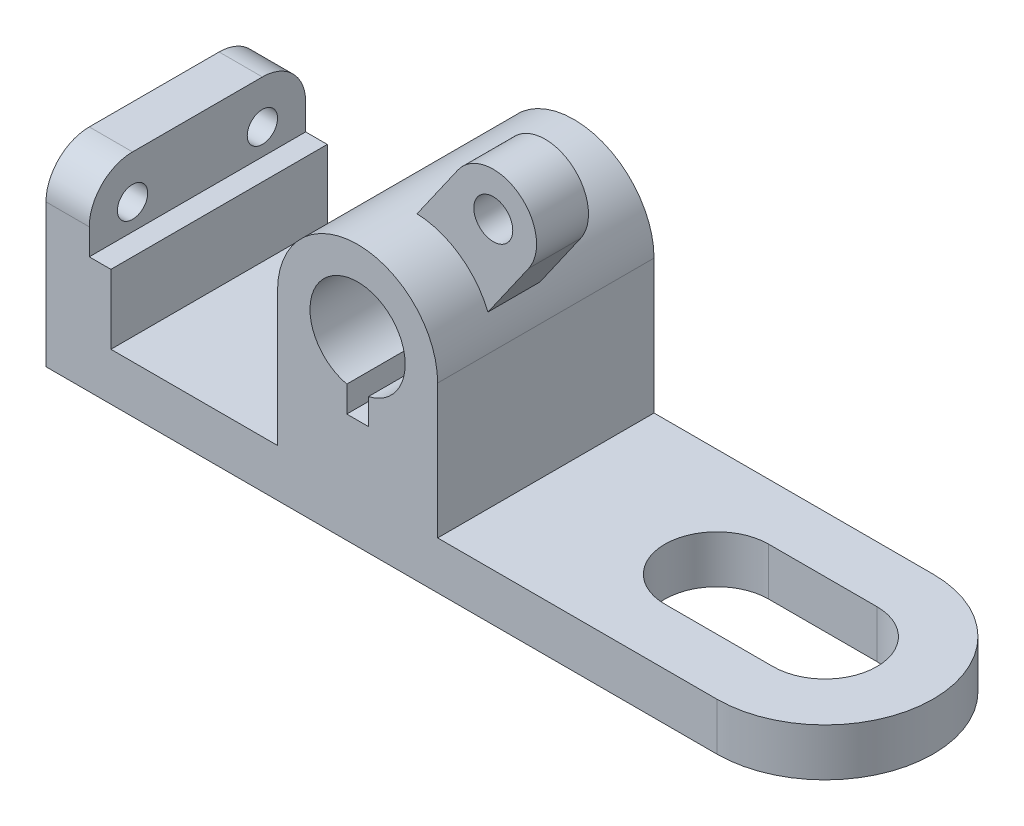
ISO-10303-21;
HEADER;
FILE_DESCRIPTION(('STEP AP214'),'2;1');
FILE_NAME('part.step','',(''),(''),'','','');
FILE_SCHEMA(('AUTOMOTIVE_DESIGN { 1 0 10303 214 1 1 1 1 }'));
ENDSEC;
DATA;
#1=APPLICATION_CONTEXT('core data for automotive mechanical design processes');
#2=APPLICATION_PROTOCOL_DEFINITION('international standard','automotive_design',2000,#1);
#3=PRODUCT_CONTEXT('',#1,'mechanical');
#4=PRODUCT('Part','Part','',(#3));
#5=PRODUCT_RELATED_PRODUCT_CATEGORY('part','',(#4));
#6=PRODUCT_DEFINITION_FORMATION('','',#4);
#7=PRODUCT_DEFINITION_CONTEXT('part definition',#1,'design');
#8=PRODUCT_DEFINITION('design','',#6,#7);
#9=PRODUCT_DEFINITION_SHAPE('','',#8);
#10=(LENGTH_UNIT() NAMED_UNIT(*) SI_UNIT(.MILLI.,.METRE.));
#11=(NAMED_UNIT(*) PLANE_ANGLE_UNIT() SI_UNIT($,.RADIAN.));
#12=(NAMED_UNIT(*) SI_UNIT($,.STERADIAN.) SOLID_ANGLE_UNIT());
#13=UNCERTAINTY_MEASURE_WITH_UNIT(LENGTH_MEASURE(1.E-05),#10,'distance_accuracy_value','');
#14=(GEOMETRIC_REPRESENTATION_CONTEXT(3) GLOBAL_UNCERTAINTY_ASSIGNED_CONTEXT((#13)) GLOBAL_UNIT_ASSIGNED_CONTEXT((#10,
#11,#12)) REPRESENTATION_CONTEXT('',''));
#15=CARTESIAN_POINT('',(0.,0.,0.));
#16=DIRECTION('',(0.,0.,1.));
#17=DIRECTION('',(1.,0.,0.));
#18=AXIS2_PLACEMENT_3D('',#15,#16,#17);
#19=CARTESIAN_POINT('',(0.,0.,25.));
#20=DIRECTION('',(0.,0.,1.));
#21=DIRECTION('',(1.,0.,0.));
#22=AXIS2_PLACEMENT_3D('',#19,#20,#21);
#23=PLANE('',#22);
#24=CARTESIAN_POINT('',(0.,42.,25.));
#25=DIRECTION('',(0.,0.,1.));
#26=DIRECTION('',(1.,0.,0.));
#27=AXIS2_PLACEMENT_3D('',#24,#25,#26);
#28=CIRCLE('',#27,11.);
#29=CARTESIAN_POINT('',(2.5,31.2878573571857,25.));
#30=VERTEX_POINT('',#29);
#31=CARTESIAN_POINT('',(-2.5,31.2878573571857,25.));
#32=VERTEX_POINT('',#31);
#33=EDGE_CURVE('E336',#30,#32,#28,.T.);
#34=ORIENTED_EDGE('',*,*,#33,.F.);
#35=DIRECTION('',(0.,-1.,0.));
#36=VECTOR('',#35,1.);
#37=CARTESIAN_POINT('',(2.5,0.,25.));
#38=LINE('',#37,#36);
#39=CARTESIAN_POINT('',(2.5,25.2878573571857,25.));
#40=VERTEX_POINT('',#39);
#41=EDGE_CURVE('E407',#30,#40,#38,.T.);
#42=ORIENTED_EDGE('',*,*,#41,.T.);
#43=DIRECTION('',(-1.,0.,0.));
#44=VECTOR('',#43,1.);
#45=CARTESIAN_POINT('',(0.,25.2878573571857,25.));
#46=LINE('',#45,#44);
#47=CARTESIAN_POINT('',(-2.5,25.2878573571857,25.));
#48=VERTEX_POINT('',#47);
#49=EDGE_CURVE('E404',#40,#48,#46,.T.);
#50=ORIENTED_EDGE('',*,*,#49,.T.);
#51=DIRECTION('',(0.,-1.,0.));
#52=VECTOR('',#51,1.);
#53=CARTESIAN_POINT('',(-2.5,0.,25.));
#54=LINE('',#53,#52);
#55=EDGE_CURVE('E402',#32,#48,#54,.T.);
#56=ORIENTED_EDGE('',*,*,#55,.F.);
#57=EDGE_LOOP('',(#34,#42,#50,#56));
#58=FACE_BOUND('',#57,.T.);
#59=DIRECTION('',(0.,-1.,0.));
#60=VECTOR('',#59,1.);
#61=CARTESIAN_POINT('',(-62.,0.,25.));
#62=LINE('',#61,#60);
#63=CARTESIAN_POINT('',(-62.,33.,25.));
#64=VERTEX_POINT('',#63);
#65=CARTESIAN_POINT('',(-62.,27.,25.));
#66=VERTEX_POINT('',#65);
#67=EDGE_CURVE('E385',#64,#66,#62,.T.);
#68=ORIENTED_EDGE('',*,*,#67,.F.);
#69=DIRECTION('',(-1.,0.,0.));
#70=VECTOR('',#69,1.);
#71=CARTESIAN_POINT('',(108.001,33.,25.));
#72=LINE('',#71,#70);
#73=CARTESIAN_POINT('',(-72.,33.,25.));
#74=VERTEX_POINT('',#73);
#75=EDGE_CURVE('E496',#64,#74,#72,.T.);
#76=ORIENTED_EDGE('',*,*,#75,.T.);
#77=DIRECTION('',(0.,1.,0.));
#78=VECTOR('',#77,1.);
#79=CARTESIAN_POINT('',(-72.,0.,25.));
#80=LINE('',#79,#78);
#81=CARTESIAN_POINT('',(-72.,0.,25.));
#82=VERTEX_POINT('',#81);
#83=EDGE_CURVE('E377',#82,#74,#80,.T.);
#84=ORIENTED_EDGE('',*,*,#83,.F.);
#85=DIRECTION('',(1.,0.,0.));
#86=VECTOR('',#85,1.);
#87=CARTESIAN_POINT('',(0.,0.,25.));
#88=LINE('',#87,#86);
#89=CARTESIAN_POINT('',(83.,0.,25.));
#90=VERTEX_POINT('',#89);
#91=EDGE_CURVE('E376',#82,#90,#88,.T.);
#92=ORIENTED_EDGE('',*,*,#91,.T.);
#93=DIRECTION('',(0.,1.,0.));
#94=VECTOR('',#93,1.);
#95=CARTESIAN_POINT('',(83.,-0.00100000000000447,25.));
#96=LINE('',#95,#94);
#97=CARTESIAN_POINT('',(83.,11.,25.));
#98=VERTEX_POINT('',#97);
#99=EDGE_CURVE('E486',#90,#98,#96,.T.);
#100=ORIENTED_EDGE('',*,*,#99,.T.);
#101=DIRECTION('',(-1.,0.,0.));
#102=VECTOR('',#101,1.);
#103=CARTESIAN_POINT('',(0.,11.,25.));
#104=LINE('',#103,#102);
#105=CARTESIAN_POINT('',(18.5,11.,25.));
#106=VERTEX_POINT('',#105);
#107=EDGE_CURVE('E320',#98,#106,#104,.T.);
#108=ORIENTED_EDGE('',*,*,#107,.T.);
#109=DIRECTION('',(0.,1.,0.));
#110=VECTOR('',#109,1.);
#111=CARTESIAN_POINT('',(18.5,0.,25.));
#112=LINE('',#111,#110);
#113=CARTESIAN_POINT('',(18.5,42.,25.));
#114=VERTEX_POINT('',#113);
#115=EDGE_CURVE('E397',#106,#114,#112,.T.);
#116=ORIENTED_EDGE('',*,*,#115,.T.);
#117=CARTESIAN_POINT('',(0.,42.,25.));
#118=DIRECTION('',(0.,0.,1.));
#119=DIRECTION('',(1.,0.,0.));
#120=AXIS2_PLACEMENT_3D('',#117,#118,#119);
#121=CIRCLE('',#120,18.5);
#122=CARTESIAN_POINT('',(-18.5,42.,25.));
#123=VERTEX_POINT('',#122);
#124=EDGE_CURVE('E398',#114,#123,#121,.T.);
#125=ORIENTED_EDGE('',*,*,#124,.T.);
#126=DIRECTION('',(0.,1.,0.));
#127=VECTOR('',#126,1.);
#128=CARTESIAN_POINT('',(-18.5,0.,25.));
#129=LINE('',#128,#127);
#130=CARTESIAN_POINT('',(-18.5,11.,25.));
#131=VERTEX_POINT('',#130);
#132=EDGE_CURVE('E394',#131,#123,#129,.T.);
#133=ORIENTED_EDGE('',*,*,#132,.F.);
#134=DIRECTION('',(1.,0.,0.));
#135=VECTOR('',#134,1.);
#136=CARTESIAN_POINT('',(0.,11.,25.));
#137=LINE('',#136,#135);
#138=CARTESIAN_POINT('',(-57.,11.,25.));
#139=VERTEX_POINT('',#138);
#140=EDGE_CURVE('E388',#139,#131,#137,.T.);
#141=ORIENTED_EDGE('',*,*,#140,.F.);
#142=DIRECTION('',(0.,-1.,0.));
#143=VECTOR('',#142,1.);
#144=CARTESIAN_POINT('',(-57.,0.,25.));
#145=LINE('',#144,#143);
#146=CARTESIAN_POINT('',(-57.,27.,25.));
#147=VERTEX_POINT('',#146);
#148=EDGE_CURVE('E390',#147,#139,#145,.T.);
#149=ORIENTED_EDGE('',*,*,#148,.F.);
#150=DIRECTION('',(1.,0.,0.));
#151=VECTOR('',#150,1.);
#152=CARTESIAN_POINT('',(0.,27.,25.));
#153=LINE('',#152,#151);
#154=EDGE_CURVE('E383',#66,#147,#153,.T.);
#155=ORIENTED_EDGE('',*,*,#154,.F.);
#156=EDGE_LOOP('',(#68,#76,#84,#92,#100,#108,#116,#125,#133,#141,#149,#155));
#157=FACE_BOUND('',#156,.T.);
#158=ADVANCED_FACE('F104',(#58,#157),#23,.T.);
#159=CARTESIAN_POINT('',(0.,0.,-25.));
#160=DIRECTION('',(0.,0.,1.));
#161=DIRECTION('',(1.,0.,0.));
#162=AXIS2_PLACEMENT_3D('',#159,#160,#161);
#163=PLANE('',#162);
#164=CARTESIAN_POINT('',(0.,42.,-25.));
#165=DIRECTION('',(0.,0.,1.));
#166=DIRECTION('',(1.,0.,0.));
#167=AXIS2_PLACEMENT_3D('',#164,#165,#166);
#168=CIRCLE('',#167,11.);
#169=CARTESIAN_POINT('',(2.5,31.2878573571857,-25.));
#170=VERTEX_POINT('',#169);
#171=CARTESIAN_POINT('',(-2.5,31.2878573571857,-25.));
#172=VERTEX_POINT('',#171);
#173=EDGE_CURVE('E371',#170,#172,#168,.T.);
#174=ORIENTED_EDGE('',*,*,#173,.T.);
#175=DIRECTION('',(0.,-1.,0.));
#176=VECTOR('',#175,1.);
#177=CARTESIAN_POINT('',(-2.5,0.,-25.));
#178=LINE('',#177,#176);
#179=CARTESIAN_POINT('',(-2.5,25.2878573571857,-25.));
#180=VERTEX_POINT('',#179);
#181=EDGE_CURVE('E365',#172,#180,#178,.T.);
#182=ORIENTED_EDGE('',*,*,#181,.T.);
#183=DIRECTION('',(-1.,0.,0.));
#184=VECTOR('',#183,1.);
#185=CARTESIAN_POINT('',(0.,25.2878573571857,-25.));
#186=LINE('',#185,#184);
#187=CARTESIAN_POINT('',(2.5,25.2878573571857,-25.));
#188=VERTEX_POINT('',#187);
#189=EDGE_CURVE('E370',#188,#180,#186,.T.);
#190=ORIENTED_EDGE('',*,*,#189,.F.);
#191=DIRECTION('',(0.,-1.,0.));
#192=VECTOR('',#191,1.);
#193=CARTESIAN_POINT('',(2.5,0.,-25.));
#194=LINE('',#193,#192);
#195=EDGE_CURVE('E369',#170,#188,#194,.T.);
#196=ORIENTED_EDGE('',*,*,#195,.F.);
#197=EDGE_LOOP('',(#174,#182,#190,#196));
#198=FACE_BOUND('',#197,.T.);
#199=DIRECTION('',(-1.,0.,0.));
#200=VECTOR('',#199,1.);
#201=CARTESIAN_POINT('',(108.001,33.,-25.));
#202=LINE('',#201,#200);
#203=CARTESIAN_POINT('',(-62.,33.,-25.));
#204=VERTEX_POINT('',#203);
#205=CARTESIAN_POINT('',(-72.,33.,-25.));
#206=VERTEX_POINT('',#205);
#207=EDGE_CURVE('E128',#204,#206,#202,.T.);
#208=ORIENTED_EDGE('',*,*,#207,.F.);
#209=DIRECTION('',(0.,-1.,0.));
#210=VECTOR('',#209,1.);
#211=CARTESIAN_POINT('',(-62.,0.,-25.));
#212=LINE('',#211,#210);
#213=CARTESIAN_POINT('',(-62.,27.,-25.));
#214=VERTEX_POINT('',#213);
#215=EDGE_CURVE('E297',#204,#214,#212,.T.);
#216=ORIENTED_EDGE('',*,*,#215,.T.);
#217=DIRECTION('',(1.,0.,0.));
#218=VECTOR('',#217,1.);
#219=CARTESIAN_POINT('',(0.,27.,-25.));
#220=LINE('',#219,#218);
#221=CARTESIAN_POINT('',(-57.,27.,-25.));
#222=VERTEX_POINT('',#221);
#223=EDGE_CURVE('E350',#214,#222,#220,.T.);
#224=ORIENTED_EDGE('',*,*,#223,.T.);
#225=DIRECTION('',(0.,-1.,0.));
#226=VECTOR('',#225,1.);
#227=CARTESIAN_POINT('',(-57.,0.,-25.));
#228=LINE('',#227,#226);
#229=CARTESIAN_POINT('',(-57.,11.,-25.));
#230=VERTEX_POINT('',#229);
#231=EDGE_CURVE('E348',#222,#230,#228,.T.);
#232=ORIENTED_EDGE('',*,*,#231,.T.);
#233=DIRECTION('',(1.,0.,0.));
#234=VECTOR('',#233,1.);
#235=CARTESIAN_POINT('',(0.,11.,-25.));
#236=LINE('',#235,#234);
#237=CARTESIAN_POINT('',(-18.5,11.,-25.));
#238=VERTEX_POINT('',#237);
#239=EDGE_CURVE('E354',#230,#238,#236,.T.);
#240=ORIENTED_EDGE('',*,*,#239,.T.);
#241=DIRECTION('',(0.,1.,0.));
#242=VECTOR('',#241,1.);
#243=CARTESIAN_POINT('',(-18.5,0.,-25.));
#244=LINE('',#243,#242);
#245=CARTESIAN_POINT('',(-18.5,42.,-25.));
#246=VERTEX_POINT('',#245);
#247=EDGE_CURVE('E358',#238,#246,#244,.T.);
#248=ORIENTED_EDGE('',*,*,#247,.T.);
#249=CARTESIAN_POINT('',(0.,42.,-25.));
#250=DIRECTION('',(0.,0.,1.));
#251=DIRECTION('',(1.,0.,0.));
#252=AXIS2_PLACEMENT_3D('',#249,#250,#251);
#253=CIRCLE('',#252,18.5);
#254=CARTESIAN_POINT('',(18.5,42.,-25.));
#255=VERTEX_POINT('',#254);
#256=EDGE_CURVE('E360',#255,#246,#253,.T.);
#257=ORIENTED_EDGE('',*,*,#256,.F.);
#258=DIRECTION('',(0.,1.,0.));
#259=VECTOR('',#258,1.);
#260=CARTESIAN_POINT('',(18.5,0.,-25.));
#261=LINE('',#260,#259);
#262=CARTESIAN_POINT('',(18.5,11.,-25.));
#263=VERTEX_POINT('',#262);
#264=EDGE_CURVE('E362',#263,#255,#261,.T.);
#265=ORIENTED_EDGE('',*,*,#264,.F.);
#266=DIRECTION('',(-1.,0.,0.));
#267=VECTOR('',#266,1.);
#268=CARTESIAN_POINT('',(0.,11.,-25.));
#269=LINE('',#268,#267);
#270=CARTESIAN_POINT('',(83.,11.,-25.));
#271=VERTEX_POINT('',#270);
#272=EDGE_CURVE('E340',#271,#263,#269,.T.);
#273=ORIENTED_EDGE('',*,*,#272,.F.);
#274=DIRECTION('',(0.,1.,0.));
#275=VECTOR('',#274,1.);
#276=CARTESIAN_POINT('',(83.,-0.00100000000000447,-25.));
#277=LINE('',#276,#275);
#278=CARTESIAN_POINT('',(83.,0.,-25.));
#279=VERTEX_POINT('',#278);
#280=EDGE_CURVE('E479',#279,#271,#277,.T.);
#281=ORIENTED_EDGE('',*,*,#280,.F.);
#282=DIRECTION('',(1.,0.,0.));
#283=VECTOR('',#282,1.);
#284=CARTESIAN_POINT('',(0.,0.,-25.));
#285=LINE('',#284,#283);
#286=CARTESIAN_POINT('',(-72.,0.,-25.));
#287=VERTEX_POINT('',#286);
#288=EDGE_CURVE('E338',#287,#279,#285,.T.);
#289=ORIENTED_EDGE('',*,*,#288,.F.);
#290=DIRECTION('',(0.,1.,0.));
#291=VECTOR('',#290,1.);
#292=CARTESIAN_POINT('',(-72.,0.,-25.));
#293=LINE('',#292,#291);
#294=EDGE_CURVE('E342',#287,#206,#293,.T.);
#295=ORIENTED_EDGE('',*,*,#294,.T.);
#296=EDGE_LOOP('',(#208,#216,#224,#232,#240,#248,#257,#265,#273,#281,#289,#295));
#297=FACE_BOUND('',#296,.T.);
#298=ADVANCED_FACE('F525',(#198,#297),#163,.F.);
#299=CARTESIAN_POINT('',(-62.,0.,25.));
#300=DIRECTION('',(1.,0.,0.));
#301=DIRECTION('',(0.,1.,0.));
#302=AXIS2_PLACEMENT_3D('',#299,#300,#301);
#303=PLANE('',#302);
#304=CARTESIAN_POINT('',(-62.,33.,15.));
#305=DIRECTION('',(1.,0.,0.));
#306=DIRECTION('',(0.,1.,0.));
#307=AXIS2_PLACEMENT_3D('',#304,#305,#306);
#308=CIRCLE('',#307,10.);
#309=CARTESIAN_POINT('',(-62.,43.,15.));
#310=VERTEX_POINT('',#309);
#311=EDGE_CURVE('E494',#64,#310,#308,.F.);
#312=ORIENTED_EDGE('',*,*,#311,.F.);
#313=ORIENTED_EDGE('',*,*,#67,.T.);
#314=DIRECTION('',(0.,0.,-1.));
#315=VECTOR('',#314,1.);
#316=CARTESIAN_POINT('',(-62.,27.,25.));
#317=LINE('',#316,#315);
#318=EDGE_CURVE('E296',#66,#214,#317,.T.);
#319=ORIENTED_EDGE('',*,*,#318,.T.);
#320=ORIENTED_EDGE('',*,*,#215,.F.);
#321=CARTESIAN_POINT('',(-62.,33.,-15.));
#322=DIRECTION('',(1.,0.,0.));
#323=DIRECTION('',(0.,1.,0.));
#324=AXIS2_PLACEMENT_3D('',#321,#322,#323);
#325=CIRCLE('',#324,10.);
#326=CARTESIAN_POINT('',(-62.,43.,-15.));
#327=VERTEX_POINT('',#326);
#328=EDGE_CURVE('E282',#204,#327,#325,.T.);
#329=ORIENTED_EDGE('',*,*,#328,.T.);
#330=DIRECTION('',(0.,0.,-1.));
#331=VECTOR('',#330,1.);
#332=CARTESIAN_POINT('',(-62.,43.,25.));
#333=LINE('',#332,#331);
#334=EDGE_CURVE('E294',#310,#327,#333,.T.);
#335=ORIENTED_EDGE('',*,*,#334,.F.);
#336=EDGE_LOOP('',(#312,#313,#319,#320,#329,#335));
#337=FACE_BOUND('',#336,.T.);
#338=CARTESIAN_POINT('',(-62.,33.,15.));
#339=DIRECTION('',(1.,0.,0.));
#340=DIRECTION('',(0.,1.,0.));
#341=AXIS2_PLACEMENT_3D('',#338,#339,#340);
#342=CIRCLE('',#341,3.5);
#343=CARTESIAN_POINT('',(-62.,36.5,15.));
#344=VERTEX_POINT('',#343);
#345=EDGE_CURVE('E495',#344,#344,#342,.F.);
#346=ORIENTED_EDGE('',*,*,#345,.T.);
#347=EDGE_LOOP('',(#346));
#348=FACE_BOUND('',#347,.T.);
#349=CARTESIAN_POINT('',(-62.,33.,-15.));
#350=DIRECTION('',(1.,0.,0.));
#351=DIRECTION('',(0.,1.,0.));
#352=AXIS2_PLACEMENT_3D('',#349,#350,#351);
#353=CIRCLE('',#352,3.5);
#354=CARTESIAN_POINT('',(-62.,36.5,-15.));
#355=VERTEX_POINT('',#354);
#356=EDGE_CURVE('E497',#355,#355,#353,.T.);
#357=ORIENTED_EDGE('',*,*,#356,.F.);
#358=EDGE_LOOP('',(#357));
#359=FACE_BOUND('',#358,.T.);
#360=ADVANCED_FACE('F295',(#337,#348,#359),#303,.T.);
#361=CARTESIAN_POINT('',(0.,43.,25.));
#362=DIRECTION('',(0.,1.,0.));
#363=DIRECTION('',(0.,0.,1.));
#364=AXIS2_PLACEMENT_3D('',#361,#362,#363);
#365=PLANE('',#364);
#366=DIRECTION('',(-1.,0.,0.));
#367=VECTOR('',#366,1.);
#368=CARTESIAN_POINT('',(108.001,43.,15.));
#369=LINE('',#368,#367);
#370=CARTESIAN_POINT('',(-72.,43.,15.));
#371=VERTEX_POINT('',#370);
#372=EDGE_CURVE('E124',#310,#371,#369,.T.);
#373=ORIENTED_EDGE('',*,*,#372,.F.);
#374=ORIENTED_EDGE('',*,*,#334,.T.);
#375=DIRECTION('',(-1.,0.,0.));
#376=VECTOR('',#375,1.);
#377=CARTESIAN_POINT('',(108.001,43.,-15.));
#378=LINE('',#377,#376);
#379=CARTESIAN_POINT('',(-72.,43.,-15.));
#380=VERTEX_POINT('',#379);
#381=EDGE_CURVE('E279',#327,#380,#378,.T.);
#382=ORIENTED_EDGE('',*,*,#381,.T.);
#383=DIRECTION('',(0.,0.,-1.));
#384=VECTOR('',#383,1.);
#385=CARTESIAN_POINT('',(-72.,43.,25.));
#386=LINE('',#385,#384);
#387=EDGE_CURVE('E298',#371,#380,#386,.T.);
#388=ORIENTED_EDGE('',*,*,#387,.F.);
#389=EDGE_LOOP('',(#373,#374,#382,#388));
#390=FACE_BOUND('',#389,.T.);
#391=ADVANCED_FACE('F299',(#390),#365,.T.);
#392=CARTESIAN_POINT('',(-72.,0.,25.));
#393=DIRECTION('',(-1.,0.,0.));
#394=DIRECTION('',(0.,0.,1.));
#395=AXIS2_PLACEMENT_3D('',#392,#393,#394);
#396=PLANE('',#395);
#397=CARTESIAN_POINT('',(-72.,33.,15.));
#398=DIRECTION('',(-1.,0.,0.));
#399=DIRECTION('',(0.,0.,1.));
#400=AXIS2_PLACEMENT_3D('',#397,#398,#399);
#401=CIRCLE('',#400,3.5);
#402=CARTESIAN_POINT('',(-72.,33.,18.5));
#403=VERTEX_POINT('',#402);
#404=EDGE_CURVE('E487',#403,#403,#401,.T.);
#405=ORIENTED_EDGE('',*,*,#404,.F.);
#406=EDGE_LOOP('',(#405));
#407=FACE_BOUND('',#406,.T.);
#408=CARTESIAN_POINT('',(-72.,33.,-15.));
#409=DIRECTION('',(-1.,0.,0.));
#410=DIRECTION('',(0.,0.,1.));
#411=AXIS2_PLACEMENT_3D('',#408,#409,#410);
#412=CIRCLE('',#411,3.5);
#413=CARTESIAN_POINT('',(-72.,33.,-11.5));
#414=VERTEX_POINT('',#413);
#415=EDGE_CURVE('E498',#414,#414,#412,.F.);
#416=ORIENTED_EDGE('',*,*,#415,.T.);
#417=EDGE_LOOP('',(#416));
#418=FACE_BOUND('',#417,.T.);
#419=ORIENTED_EDGE('',*,*,#83,.T.);
#420=CARTESIAN_POINT('',(-72.,33.,15.));
#421=DIRECTION('',(-1.,0.,0.));
#422=DIRECTION('',(0.,0.,1.));
#423=AXIS2_PLACEMENT_3D('',#420,#421,#422);
#424=CIRCLE('',#423,10.);
#425=EDGE_CURVE('E501',#74,#371,#424,.T.);
#426=ORIENTED_EDGE('',*,*,#425,.T.);
#427=ORIENTED_EDGE('',*,*,#387,.T.);
#428=CARTESIAN_POINT('',(-72.,33.,-15.));
#429=DIRECTION('',(-1.,0.,0.));
#430=DIRECTION('',(0.,0.,1.));
#431=AXIS2_PLACEMENT_3D('',#428,#429,#430);
#432=CIRCLE('',#431,10.);
#433=EDGE_CURVE('E285',#206,#380,#432,.F.);
#434=ORIENTED_EDGE('',*,*,#433,.F.);
#435=ORIENTED_EDGE('',*,*,#294,.F.);
#436=DIRECTION('',(0.,0.,-1.));
#437=VECTOR('',#436,1.);
#438=CARTESIAN_POINT('',(-72.,0.,25.));
#439=LINE('',#438,#437);
#440=EDGE_CURVE('E305',#82,#287,#439,.T.);
#441=ORIENTED_EDGE('',*,*,#440,.F.);
#442=EDGE_LOOP('',(#419,#426,#427,#434,#435,#441));
#443=FACE_BOUND('',#442,.T.);
#444=ADVANCED_FACE('F512',(#407,#418,#443),#396,.T.);
#445=CARTESIAN_POINT('',(18.5,0.,25.));
#446=DIRECTION('',(-1.,0.,0.));
#447=DIRECTION('',(0.,-1.,0.));
#448=AXIS2_PLACEMENT_3D('',#445,#446,#447);
#449=PLANE('',#448);
#450=ORIENTED_EDGE('',*,*,#264,.T.);
#451=DIRECTION('',(0.,0.,-1.));
#452=VECTOR('',#451,1.);
#453=CARTESIAN_POINT('',(18.5,42.,25.));
#454=LINE('',#453,#452);
#455=EDGE_CURVE('E12',#114,#255,#454,.T.);
#456=ORIENTED_EDGE('',*,*,#455,.F.);
#457=ORIENTED_EDGE('',*,*,#115,.F.);
#458=DIRECTION('',(0.,0.,-1.));
#459=VECTOR('',#458,1.);
#460=CARTESIAN_POINT('',(18.5,11.,25.));
#461=LINE('',#460,#459);
#462=EDGE_CURVE('E324',#106,#263,#461,.T.);
#463=ORIENTED_EDGE('',*,*,#462,.T.);
#464=EDGE_LOOP('',(#450,#456,#457,#463));
#465=FACE_BOUND('',#464,.T.);
#466=ADVANCED_FACE('F538',(#465),#449,.F.);
#467=CARTESIAN_POINT('',(0.,42.,25.));
#468=DIRECTION('',(0.,0.,-1.));
#469=DIRECTION('',(-1.,0.,0.));
#470=AXIS2_PLACEMENT_3D('',#467,#468,#469);
#471=CYLINDRICAL_SURFACE('',#470,18.5);
#472=DIRECTION('',(0.,0.,-1.));
#473=VECTOR('',#472,1.);
#474=CARTESIAN_POINT('',(17.1188834432209,49.0138313108754,12.));
#475=LINE('',#474,#473);
#476=CARTESIAN_POINT('',(17.1188834432209,49.0138313108754,12.));
#477=VERTEX_POINT('',#476);
#478=CARTESIAN_POINT('',(17.1188834432209,49.0138313108755,0.));
#479=VERTEX_POINT('',#478);
#480=EDGE_CURVE('E418',#477,#479,#475,.T.);
#481=ORIENTED_EDGE('',*,*,#480,.F.);
#482=CARTESIAN_POINT('',(0.,42.,12.));
#483=DIRECTION('',(0.,0.,1.));
#484=DIRECTION('',(1.,0.,0.));
#485=AXIS2_PLACEMENT_3D('',#482,#483,#484);
#486=CIRCLE('',#485,18.5);
#487=CARTESIAN_POINT('',(0.735842557441118,60.4853600378964,12.));
#488=VERTEX_POINT('',#487);
#489=EDGE_CURVE('E420',#477,#488,#486,.T.);
#490=ORIENTED_EDGE('',*,*,#489,.T.);
#491=DIRECTION('',(0.,0.,-1.));
#492=VECTOR('',#491,1.);
#493=CARTESIAN_POINT('',(0.735842557441111,60.4853600378964,12.));
#494=LINE('',#493,#492);
#495=CARTESIAN_POINT('',(0.735842557441111,60.4853600378964,0.));
#496=VERTEX_POINT('',#495);
#497=EDGE_CURVE('E415',#488,#496,#494,.T.);
#498=ORIENTED_EDGE('',*,*,#497,.T.);
#499=CARTESIAN_POINT('',(0.,42.,0.));
#500=DIRECTION('',(0.,0.,1.));
#501=DIRECTION('',(1.,0.,0.));
#502=AXIS2_PLACEMENT_3D('',#499,#500,#501);
#503=CIRCLE('',#502,18.5);
#504=EDGE_CURVE('E419',#479,#496,#503,.T.);
#505=ORIENTED_EDGE('',*,*,#504,.F.);
#506=EDGE_LOOP('',(#481,#490,#498,#505));
#507=FACE_BOUND('',#506,.T.);
#508=ORIENTED_EDGE('',*,*,#256,.T.);
#509=DIRECTION('',(0.,0.,-1.));
#510=VECTOR('',#509,1.);
#511=CARTESIAN_POINT('',(-18.5,42.,25.));
#512=LINE('',#511,#510);
#513=EDGE_CURVE('E111',#123,#246,#512,.T.);
#514=ORIENTED_EDGE('',*,*,#513,.F.);
#515=ORIENTED_EDGE('',*,*,#124,.F.);
#516=ORIENTED_EDGE('',*,*,#455,.T.);
#517=EDGE_LOOP('',(#508,#514,#515,#516));
#518=FACE_BOUND('',#517,.T.);
#519=ADVANCED_FACE('F543',(#507,#518),#471,.T.);
#520=CARTESIAN_POINT('',(-18.5,0.,25.));
#521=DIRECTION('',(-1.,0.,0.));
#522=DIRECTION('',(0.,-1.,0.));
#523=AXIS2_PLACEMENT_3D('',#520,#521,#522);
#524=PLANE('',#523);
#525=ORIENTED_EDGE('',*,*,#247,.F.);
#526=DIRECTION('',(0.,0.,-1.));
#527=VECTOR('',#526,1.);
#528=CARTESIAN_POINT('',(-18.5,11.,25.));
#529=LINE('',#528,#527);
#530=EDGE_CURVE('E313',#131,#238,#529,.T.);
#531=ORIENTED_EDGE('',*,*,#530,.F.);
#532=ORIENTED_EDGE('',*,*,#132,.T.);
#533=ORIENTED_EDGE('',*,*,#513,.T.);
#534=EDGE_LOOP('',(#525,#531,#532,#533));
#535=FACE_BOUND('',#534,.T.);
#536=ADVANCED_FACE('F546',(#535),#524,.T.);
#537=CARTESIAN_POINT('',(0.,11.,25.));
#538=DIRECTION('',(0.,1.,0.));
#539=DIRECTION('',(0.,0.,1.));
#540=AXIS2_PLACEMENT_3D('',#537,#538,#539);
#541=PLANE('',#540);
#542=ORIENTED_EDGE('',*,*,#239,.F.);
#543=DIRECTION('',(0.,0.,-1.));
#544=VECTOR('',#543,1.);
#545=CARTESIAN_POINT('',(-57.,11.,25.));
#546=LINE('',#545,#544);
#547=EDGE_CURVE('E310',#139,#230,#546,.T.);
#548=ORIENTED_EDGE('',*,*,#547,.F.);
#549=ORIENTED_EDGE('',*,*,#140,.T.);
#550=ORIENTED_EDGE('',*,*,#530,.T.);
#551=EDGE_LOOP('',(#542,#548,#549,#550));
#552=FACE_BOUND('',#551,.T.);
#553=ADVANCED_FACE('F548',(#552),#541,.T.);
#554=CARTESIAN_POINT('',(-57.,0.,25.));
#555=DIRECTION('',(1.,0.,0.));
#556=DIRECTION('',(0.,0.,-1.));
#557=AXIS2_PLACEMENT_3D('',#554,#555,#556);
#558=PLANE('',#557);
#559=ORIENTED_EDGE('',*,*,#231,.F.);
#560=DIRECTION('',(0.,0.,-1.));
#561=VECTOR('',#560,1.);
#562=CARTESIAN_POINT('',(-57.,27.,25.));
#563=LINE('',#562,#561);
#564=EDGE_CURVE('E304',#147,#222,#563,.T.);
#565=ORIENTED_EDGE('',*,*,#564,.F.);
#566=ORIENTED_EDGE('',*,*,#148,.T.);
#567=ORIENTED_EDGE('',*,*,#547,.T.);
#568=EDGE_LOOP('',(#559,#565,#566,#567));
#569=FACE_BOUND('',#568,.T.);
#570=ADVANCED_FACE('F552',(#569),#558,.T.);
#571=CARTESIAN_POINT('',(0.,27.,25.));
#572=DIRECTION('',(0.,1.,0.));
#573=DIRECTION('',(0.,0.,1.));
#574=AXIS2_PLACEMENT_3D('',#571,#572,#573);
#575=PLANE('',#574);
#576=ORIENTED_EDGE('',*,*,#223,.F.);
#577=ORIENTED_EDGE('',*,*,#318,.F.);
#578=ORIENTED_EDGE('',*,*,#154,.T.);
#579=ORIENTED_EDGE('',*,*,#564,.T.);
#580=EDGE_LOOP('',(#576,#577,#578,#579));
#581=FACE_BOUND('',#580,.T.);
#582=ADVANCED_FACE('F523',(#581),#575,.T.);
#583=CARTESIAN_POINT('',(0.,0.,25.));
#584=DIRECTION('',(0.,1.,0.));
#585=DIRECTION('',(-1.,0.,0.));
#586=AXIS2_PLACEMENT_3D('',#583,#584,#585);
#587=PLANE('',#586);
#588=CARTESIAN_POINT('',(58.,0.,0.));
#589=DIRECTION('',(0.,1.,0.));
#590=DIRECTION('',(-1.,0.,0.));
#591=AXIS2_PLACEMENT_3D('',#588,#589,#590);
#592=CIRCLE('',#591,12.);
#593=CARTESIAN_POINT('',(58.,0.,12.));
#594=VERTEX_POINT('',#593);
#595=CARTESIAN_POINT('',(58.,0.,-12.));
#596=VERTEX_POINT('',#595);
#597=EDGE_CURVE('E471',#594,#596,#592,.F.);
#598=ORIENTED_EDGE('',*,*,#597,.F.);
#599=DIRECTION('',(-1.,0.,0.));
#600=VECTOR('',#599,1.);
#601=CARTESIAN_POINT('',(0.,0.,12.));
#602=LINE('',#601,#600);
#603=CARTESIAN_POINT('',(83.,0.,12.));
#604=VERTEX_POINT('',#603);
#605=EDGE_CURVE('E466',#604,#594,#602,.T.);
#606=ORIENTED_EDGE('',*,*,#605,.F.);
#607=CARTESIAN_POINT('',(83.,0.,0.));
#608=DIRECTION('',(0.,1.,0.));
#609=DIRECTION('',(-1.,0.,0.));
#610=AXIS2_PLACEMENT_3D('',#607,#608,#609);
#611=CIRCLE('',#610,12.);
#612=CARTESIAN_POINT('',(83.,0.,-12.));
#613=VERTEX_POINT('',#612);
#614=EDGE_CURVE('E436',#613,#604,#611,.F.);
#615=ORIENTED_EDGE('',*,*,#614,.F.);
#616=DIRECTION('',(-1.,0.,0.));
#617=VECTOR('',#616,1.);
#618=CARTESIAN_POINT('',(0.,0.,-12.));
#619=LINE('',#618,#617);
#620=EDGE_CURVE('E478',#613,#596,#619,.T.);
#621=ORIENTED_EDGE('',*,*,#620,.T.);
#622=EDGE_LOOP('',(#598,#606,#615,#621));
#623=FACE_BOUND('',#622,.T.);
#624=CARTESIAN_POINT('',(83.,0.,0.));
#625=DIRECTION('',(0.,1.,0.));
#626=DIRECTION('',(-1.,0.,0.));
#627=AXIS2_PLACEMENT_3D('',#624,#625,#626);
#628=CIRCLE('',#627,25.);
#629=EDGE_CURVE('E482',#279,#90,#628,.F.);
#630=ORIENTED_EDGE('',*,*,#629,.T.);
#631=ORIENTED_EDGE('',*,*,#91,.F.);
#632=ORIENTED_EDGE('',*,*,#440,.T.);
#633=ORIENTED_EDGE('',*,*,#288,.T.);
#634=EDGE_LOOP('',(#630,#631,#632,#633));
#635=FACE_BOUND('',#634,.T.);
#636=ADVANCED_FACE('F529',(#623,#635),#587,.F.);
#637=CARTESIAN_POINT('',(0.,42.,25.));
#638=DIRECTION('',(0.,0.,-1.));
#639=DIRECTION('',(-1.,0.,0.));
#640=AXIS2_PLACEMENT_3D('',#637,#638,#639);
#641=CYLINDRICAL_SURFACE('',#640,11.);
#642=ORIENTED_EDGE('',*,*,#173,.F.);
#643=DIRECTION('',(0.,0.,-1.));
#644=VECTOR('',#643,1.);
#645=CARTESIAN_POINT('',(2.5,31.2878573571857,25.));
#646=LINE('',#645,#644);
#647=EDGE_CURVE('E108',#30,#170,#646,.T.);
#648=ORIENTED_EDGE('',*,*,#647,.F.);
#649=ORIENTED_EDGE('',*,*,#33,.T.);
#650=DIRECTION('',(0.,0.,-1.));
#651=VECTOR('',#650,1.);
#652=CARTESIAN_POINT('',(-2.5,31.2878573571857,25.));
#653=LINE('',#652,#651);
#654=EDGE_CURVE('E314',#32,#172,#653,.T.);
#655=ORIENTED_EDGE('',*,*,#654,.T.);
#656=EDGE_LOOP('',(#642,#648,#649,#655));
#657=FACE_BOUND('',#656,.T.);
#658=ADVANCED_FACE('F110',(#657),#641,.F.);
#659=CARTESIAN_POINT('',(2.5,0.,25.));
#660=DIRECTION('',(1.,0.,0.));
#661=DIRECTION('',(0.,1.,0.));
#662=AXIS2_PLACEMENT_3D('',#659,#660,#661);
#663=PLANE('',#662);
#664=ORIENTED_EDGE('',*,*,#195,.T.);
#665=DIRECTION('',(0.,0.,-1.));
#666=VECTOR('',#665,1.);
#667=CARTESIAN_POINT('',(2.5,25.2878573571857,25.));
#668=LINE('',#667,#666);
#669=EDGE_CURVE('E318',#40,#188,#668,.T.);
#670=ORIENTED_EDGE('',*,*,#669,.F.);
#671=ORIENTED_EDGE('',*,*,#41,.F.);
#672=ORIENTED_EDGE('',*,*,#647,.T.);
#673=EDGE_LOOP('',(#664,#670,#671,#672));
#674=FACE_BOUND('',#673,.T.);
#675=ADVANCED_FACE('F712',(#674),#663,.F.);
#676=CARTESIAN_POINT('',(0.,25.2878573571857,25.));
#677=DIRECTION('',(0.,-1.,0.));
#678=DIRECTION('',(0.,0.,-1.));
#679=AXIS2_PLACEMENT_3D('',#676,#677,#678);
#680=PLANE('',#679);
#681=ORIENTED_EDGE('',*,*,#189,.T.);
#682=DIRECTION('',(0.,0.,-1.));
#683=VECTOR('',#682,1.);
#684=CARTESIAN_POINT('',(-2.5,25.2878573571857,25.));
#685=LINE('',#684,#683);
#686=EDGE_CURVE('E316',#48,#180,#685,.T.);
#687=ORIENTED_EDGE('',*,*,#686,.F.);
#688=ORIENTED_EDGE('',*,*,#49,.F.);
#689=ORIENTED_EDGE('',*,*,#669,.T.);
#690=EDGE_LOOP('',(#681,#687,#688,#689));
#691=FACE_BOUND('',#690,.T.);
#692=ADVANCED_FACE('F709',(#691),#680,.F.);
#693=CARTESIAN_POINT('',(-2.5,0.,25.));
#694=DIRECTION('',(1.,0.,0.));
#695=DIRECTION('',(0.,1.,0.));
#696=AXIS2_PLACEMENT_3D('',#693,#694,#695);
#697=PLANE('',#696);
#698=ORIENTED_EDGE('',*,*,#181,.F.);
#699=ORIENTED_EDGE('',*,*,#654,.F.);
#700=ORIENTED_EDGE('',*,*,#55,.T.);
#701=ORIENTED_EDGE('',*,*,#686,.T.);
#702=EDGE_LOOP('',(#698,#699,#700,#701));
#703=FACE_BOUND('',#702,.T.);
#704=ADVANCED_FACE('F579',(#703),#697,.T.);
#705=CARTESIAN_POINT('',(0.,11.,25.));
#706=DIRECTION('',(0.,-1.,0.));
#707=DIRECTION('',(1.,0.,0.));
#708=AXIS2_PLACEMENT_3D('',#705,#706,#707);
#709=PLANE('',#708);
#710=CARTESIAN_POINT('',(83.,11.,0.));
#711=DIRECTION('',(0.,1.,0.));
#712=DIRECTION('',(-1.,0.,0.));
#713=AXIS2_PLACEMENT_3D('',#710,#711,#712);
#714=CIRCLE('',#713,12.);
#715=CARTESIAN_POINT('',(83.,11.,12.));
#716=VERTEX_POINT('',#715);
#717=CARTESIAN_POINT('',(83.,11.,-12.));
#718=VERTEX_POINT('',#717);
#719=EDGE_CURVE('E463',#716,#718,#714,.T.);
#720=ORIENTED_EDGE('',*,*,#719,.F.);
#721=DIRECTION('',(1.,0.,0.));
#722=VECTOR('',#721,1.);
#723=CARTESIAN_POINT('',(0.,11.,12.));
#724=LINE('',#723,#722);
#725=CARTESIAN_POINT('',(58.,11.,12.));
#726=VERTEX_POINT('',#725);
#727=EDGE_CURVE('E467',#726,#716,#724,.T.);
#728=ORIENTED_EDGE('',*,*,#727,.F.);
#729=CARTESIAN_POINT('',(58.,11.,0.));
#730=DIRECTION('',(0.,1.,0.));
#731=DIRECTION('',(-1.,0.,0.));
#732=AXIS2_PLACEMENT_3D('',#729,#730,#731);
#733=CIRCLE('',#732,12.);
#734=CARTESIAN_POINT('',(58.,11.,-12.));
#735=VERTEX_POINT('',#734);
#736=EDGE_CURVE('E451',#735,#726,#733,.T.);
#737=ORIENTED_EDGE('',*,*,#736,.F.);
#738=DIRECTION('',(1.,0.,0.));
#739=VECTOR('',#738,1.);
#740=CARTESIAN_POINT('',(0.,11.,-12.));
#741=LINE('',#740,#739);
#742=EDGE_CURVE('E465',#735,#718,#741,.T.);
#743=ORIENTED_EDGE('',*,*,#742,.T.);
#744=EDGE_LOOP('',(#720,#728,#737,#743));
#745=FACE_BOUND('',#744,.T.);
#746=ORIENTED_EDGE('',*,*,#107,.F.);
#747=CARTESIAN_POINT('',(83.,11.,0.));
#748=DIRECTION('',(0.,1.,0.));
#749=DIRECTION('',(-1.,0.,0.));
#750=AXIS2_PLACEMENT_3D('',#747,#748,#749);
#751=CIRCLE('',#750,25.);
#752=EDGE_CURVE('E481',#98,#271,#751,.T.);
#753=ORIENTED_EDGE('',*,*,#752,.T.);
#754=ORIENTED_EDGE('',*,*,#272,.T.);
#755=ORIENTED_EDGE('',*,*,#462,.F.);
#756=EDGE_LOOP('',(#746,#753,#754,#755));
#757=FACE_BOUND('',#756,.T.);
#758=ADVANCED_FACE('F532',(#745,#757),#709,.F.);
#759=CARTESIAN_POINT('',(-11.5420245936143,8.08181262665066,12.));
#760=DIRECTION('',(-0.819152044288989,0.57357643635105,0.));
#761=DIRECTION('',(-0.57357643635105,-0.819152044288989,0.));
#762=AXIS2_PLACEMENT_3D('',#759,#760,#761);
#763=PLANE('',#762);
#764=DIRECTION('',(0.57357643635105,0.819152044288989,0.));
#765=VECTOR('',#764,1.);
#766=CARTESIAN_POINT('',(-11.5420245936143,8.08181262665066,0.));
#767=LINE('',#766,#765);
#768=CARTESIAN_POINT('',(26.5459664061235,62.4771010537372,0.));
#769=VERTEX_POINT('',#768);
#770=EDGE_CURVE('E429',#479,#769,#767,.T.);
#771=ORIENTED_EDGE('',*,*,#770,.T.);
#772=DIRECTION('',(0.,0.,-1.));
#773=VECTOR('',#772,1.);
#774=CARTESIAN_POINT('',(26.5459664061235,62.4771010537372,12.));
#775=LINE('',#774,#773);
#776=CARTESIAN_POINT('',(26.5459664061235,62.4771010537372,12.));
#777=VERTEX_POINT('',#776);
#778=EDGE_CURVE('E372',#777,#769,#775,.T.);
#779=ORIENTED_EDGE('',*,*,#778,.F.);
#780=DIRECTION('',(0.57357643635105,0.819152044288989,0.));
#781=VECTOR('',#780,1.);
#782=CARTESIAN_POINT('',(-11.5420245936143,8.08181262665066,12.));
#783=LINE('',#782,#781);
#784=EDGE_CURVE('E444',#477,#777,#783,.T.);
#785=ORIENTED_EDGE('',*,*,#784,.F.);
#786=ORIENTED_EDGE('',*,*,#480,.T.);
#787=EDGE_LOOP('',(#771,#779,#785,#786));
#788=FACE_BOUND('',#787,.T.);
#789=ADVANCED_FACE('F578',(#788),#763,.F.);
#790=CARTESIAN_POINT('',(18.3544459632336,68.2128654172477,12.));
#791=DIRECTION('',(0.,0.,-1.));
#792=DIRECTION('',(-1.,0.,0.));
#793=AXIS2_PLACEMENT_3D('',#790,#791,#792);
#794=CYLINDRICAL_SURFACE('',#793,10.);
#795=CARTESIAN_POINT('',(18.3544459632336,68.2128654172477,0.));
#796=DIRECTION('',(0.,0.,1.));
#797=DIRECTION('',(1.,0.,0.));
#798=AXIS2_PLACEMENT_3D('',#795,#796,#797);
#799=CIRCLE('',#798,10.);
#800=CARTESIAN_POINT('',(10.1629255203437,73.9486297807582,0.));
#801=VERTEX_POINT('',#800);
#802=EDGE_CURVE('E430',#769,#801,#799,.T.);
#803=ORIENTED_EDGE('',*,*,#802,.T.);
#804=DIRECTION('',(0.,0.,-1.));
#805=VECTOR('',#804,1.);
#806=CARTESIAN_POINT('',(10.1629255203437,73.9486297807582,12.));
#807=LINE('',#806,#805);
#808=CARTESIAN_POINT('',(10.1629255203437,73.9486297807582,12.));
#809=VERTEX_POINT('',#808);
#810=EDGE_CURVE('E414',#809,#801,#807,.T.);
#811=ORIENTED_EDGE('',*,*,#810,.F.);
#812=CARTESIAN_POINT('',(18.3544459632336,68.2128654172477,12.));
#813=DIRECTION('',(0.,0.,1.));
#814=DIRECTION('',(1.,0.,0.));
#815=AXIS2_PLACEMENT_3D('',#812,#813,#814);
#816=CIRCLE('',#815,10.);
#817=EDGE_CURVE('E442',#777,#809,#816,.T.);
#818=ORIENTED_EDGE('',*,*,#817,.F.);
#819=ORIENTED_EDGE('',*,*,#778,.T.);
#820=EDGE_LOOP('',(#803,#811,#818,#819));
#821=FACE_BOUND('',#820,.T.);
#822=ADVANCED_FACE('F678',(#821),#794,.T.);
#823=CARTESIAN_POINT('',(-27.9250654793941,19.5533413536717,12.));
#824=DIRECTION('',(-0.819152044288989,0.57357643635105,0.));
#825=DIRECTION('',(-0.57357643635105,-0.819152044288989,0.));
#826=AXIS2_PLACEMENT_3D('',#823,#824,#825);
#827=PLANE('',#826);
#828=DIRECTION('',(0.57357643635105,0.819152044288989,0.));
#829=VECTOR('',#828,1.);
#830=CARTESIAN_POINT('',(-27.9250654793941,19.5533413536717,0.));
#831=LINE('',#830,#829);
#832=EDGE_CURVE('E424',#496,#801,#831,.T.);
#833=ORIENTED_EDGE('',*,*,#832,.F.);
#834=ORIENTED_EDGE('',*,*,#497,.F.);
#835=DIRECTION('',(0.57357643635105,0.819152044288989,0.));
#836=VECTOR('',#835,1.);
#837=CARTESIAN_POINT('',(-27.9250654793941,19.5533413536717,12.));
#838=LINE('',#837,#836);
#839=EDGE_CURVE('E437',#488,#809,#838,.T.);
#840=ORIENTED_EDGE('',*,*,#839,.T.);
#841=ORIENTED_EDGE('',*,*,#810,.T.);
#842=EDGE_LOOP('',(#833,#834,#840,#841));
#843=FACE_BOUND('',#842,.T.);
#844=ADVANCED_FACE('F680',(#843),#827,.T.);
#845=CARTESIAN_POINT('',(18.3544459632336,68.2128654172477,12.));
#846=DIRECTION('',(0.,0.,-1.));
#847=DIRECTION('',(-1.,0.,0.));
#848=AXIS2_PLACEMENT_3D('',#845,#846,#847);
#849=CYLINDRICAL_SURFACE('',#848,4.50000000000001);
#850=CARTESIAN_POINT('',(18.3544459632336,68.2128654172477,12.));
#851=DIRECTION('',(0.,0.,1.));
#852=DIRECTION('',(1.,0.,0.));
#853=AXIS2_PLACEMENT_3D('',#850,#851,#852);
#854=CIRCLE('',#853,4.50000000000001);
#855=CARTESIAN_POINT('',(22.8544459632336,68.2128654172477,12.));
#856=VERTEX_POINT('',#855);
#857=EDGE_CURVE('E421',#856,#856,#854,.T.);
#858=ORIENTED_EDGE('',*,*,#857,.T.);
#859=EDGE_LOOP('',(#858));
#860=FACE_BOUND('',#859,.T.);
#861=CARTESIAN_POINT('',(18.3544459632336,68.2128654172477,0.));
#862=DIRECTION('',(0.,0.,1.));
#863=DIRECTION('',(1.,0.,0.));
#864=AXIS2_PLACEMENT_3D('',#861,#862,#863);
#865=CIRCLE('',#864,4.50000000000001);
#866=CARTESIAN_POINT('',(22.8544459632336,68.2128654172477,0.));
#867=VERTEX_POINT('',#866);
#868=EDGE_CURVE('E433',#867,#867,#865,.T.);
#869=ORIENTED_EDGE('',*,*,#868,.F.);
#870=EDGE_LOOP('',(#869));
#871=FACE_BOUND('',#870,.T.);
#872=ADVANCED_FACE('F572',(#860,#871),#849,.F.);
#873=CARTESIAN_POINT('',(0.,0.,12.));
#874=DIRECTION('',(0.,0.,1.));
#875=DIRECTION('',(1.,0.,0.));
#876=AXIS2_PLACEMENT_3D('',#873,#874,#875);
#877=PLANE('',#876);
#878=ORIENTED_EDGE('',*,*,#857,.F.);
#879=EDGE_LOOP('',(#878));
#880=FACE_BOUND('',#879,.T.);
#881=ORIENTED_EDGE('',*,*,#784,.T.);
#882=ORIENTED_EDGE('',*,*,#817,.T.);
#883=ORIENTED_EDGE('',*,*,#839,.F.);
#884=ORIENTED_EDGE('',*,*,#489,.F.);
#885=EDGE_LOOP('',(#881,#882,#883,#884));
#886=FACE_BOUND('',#885,.T.);
#887=ADVANCED_FACE('F668',(#880,#886),#877,.T.);
#888=CARTESIAN_POINT('',(0.,0.,0.));
#889=DIRECTION('',(0.,0.,1.));
#890=DIRECTION('',(1.,0.,0.));
#891=AXIS2_PLACEMENT_3D('',#888,#889,#890);
#892=PLANE('',#891);
#893=ORIENTED_EDGE('',*,*,#868,.T.);
#894=EDGE_LOOP('',(#893));
#895=FACE_BOUND('',#894,.T.);
#896=ORIENTED_EDGE('',*,*,#770,.F.);
#897=ORIENTED_EDGE('',*,*,#504,.T.);
#898=ORIENTED_EDGE('',*,*,#832,.T.);
#899=ORIENTED_EDGE('',*,*,#802,.F.);
#900=EDGE_LOOP('',(#896,#897,#898,#899));
#901=FACE_BOUND('',#900,.T.);
#902=ADVANCED_FACE('F669',(#895,#901),#892,.F.);
#903=CARTESIAN_POINT('',(0.,-0.00100000000002876,12.));
#904=DIRECTION('',(0.,0.,1.));
#905=DIRECTION('',(1.,0.,0.));
#906=AXIS2_PLACEMENT_3D('',#903,#904,#905);
#907=PLANE('',#906);
#908=ORIENTED_EDGE('',*,*,#605,.T.);
#909=DIRECTION('',(0.,1.,0.));
#910=VECTOR('',#909,1.);
#911=CARTESIAN_POINT('',(58.,-0.00100000000001314,12.));
#912=LINE('',#911,#910);
#913=EDGE_CURVE('E448',#594,#726,#912,.T.);
#914=ORIENTED_EDGE('',*,*,#913,.T.);
#915=ORIENTED_EDGE('',*,*,#727,.T.);
#916=DIRECTION('',(0.,1.,0.));
#917=VECTOR('',#916,1.);
#918=CARTESIAN_POINT('',(83.,-0.00100000000000447,12.));
#919=LINE('',#918,#917);
#920=EDGE_CURVE('E453',#604,#716,#919,.T.);
#921=ORIENTED_EDGE('',*,*,#920,.F.);
#922=EDGE_LOOP('',(#908,#914,#915,#921));
#923=FACE_BOUND('',#922,.T.);
#924=ADVANCED_FACE('F657',(#923),#907,.F.);
#925=CARTESIAN_POINT('',(58.,-0.00100000000001314,0.));
#926=DIRECTION('',(0.,1.,0.));
#927=DIRECTION('',(-1.,0.,0.));
#928=AXIS2_PLACEMENT_3D('',#925,#926,#927);
#929=CYLINDRICAL_SURFACE('',#928,12.);
#930=ORIENTED_EDGE('',*,*,#597,.T.);
#931=DIRECTION('',(0.,1.,0.));
#932=VECTOR('',#931,1.);
#933=CARTESIAN_POINT('',(58.,-0.00100000000001314,-12.));
#934=LINE('',#933,#932);
#935=EDGE_CURVE('E460',#596,#735,#934,.T.);
#936=ORIENTED_EDGE('',*,*,#935,.T.);
#937=ORIENTED_EDGE('',*,*,#736,.T.);
#938=ORIENTED_EDGE('',*,*,#913,.F.);
#939=EDGE_LOOP('',(#930,#936,#937,#938));
#940=FACE_BOUND('',#939,.T.);
#941=ADVANCED_FACE('F652',(#940),#929,.F.);
#942=CARTESIAN_POINT('',(0.,-0.00100000000002876,-12.));
#943=DIRECTION('',(0.,0.,1.));
#944=DIRECTION('',(1.,0.,0.));
#945=AXIS2_PLACEMENT_3D('',#942,#943,#944);
#946=PLANE('',#945);
#947=DIRECTION('',(0.,1.,0.));
#948=VECTOR('',#947,1.);
#949=CARTESIAN_POINT('',(83.,-0.00100000000000447,-12.));
#950=LINE('',#949,#948);
#951=EDGE_CURVE('E455',#613,#718,#950,.T.);
#952=ORIENTED_EDGE('',*,*,#951,.T.);
#953=ORIENTED_EDGE('',*,*,#742,.F.);
#954=ORIENTED_EDGE('',*,*,#935,.F.);
#955=ORIENTED_EDGE('',*,*,#620,.F.);
#956=EDGE_LOOP('',(#952,#953,#954,#955));
#957=FACE_BOUND('',#956,.T.);
#958=ADVANCED_FACE('F660',(#957),#946,.T.);
#959=CARTESIAN_POINT('',(83.,-0.00100000000000447,0.));
#960=DIRECTION('',(0.,1.,0.));
#961=DIRECTION('',(-1.,0.,0.));
#962=AXIS2_PLACEMENT_3D('',#959,#960,#961);
#963=CYLINDRICAL_SURFACE('',#962,12.);
#964=ORIENTED_EDGE('',*,*,#614,.T.);
#965=ORIENTED_EDGE('',*,*,#920,.T.);
#966=ORIENTED_EDGE('',*,*,#719,.T.);
#967=ORIENTED_EDGE('',*,*,#951,.F.);
#968=EDGE_LOOP('',(#964,#965,#966,#967));
#969=FACE_BOUND('',#968,.T.);
#970=ADVANCED_FACE('F653',(#969),#963,.F.);
#971=CARTESIAN_POINT('',(83.,-0.00100000000000447,0.));
#972=DIRECTION('',(0.,1.,0.));
#973=DIRECTION('',(-1.,0.,0.));
#974=AXIS2_PLACEMENT_3D('',#971,#972,#973);
#975=CYLINDRICAL_SURFACE('',#974,25.);
#976=ORIENTED_EDGE('',*,*,#280,.T.);
#977=ORIENTED_EDGE('',*,*,#752,.F.);
#978=ORIENTED_EDGE('',*,*,#99,.F.);
#979=ORIENTED_EDGE('',*,*,#629,.F.);
#980=EDGE_LOOP('',(#976,#977,#978,#979));
#981=FACE_BOUND('',#980,.T.);
#982=ADVANCED_FACE('F612',(#981),#975,.T.);
#983=CARTESIAN_POINT('',(108.001,33.,15.));
#984=DIRECTION('',(-1.,0.,0.));
#985=DIRECTION('',(0.,0.,1.));
#986=AXIS2_PLACEMENT_3D('',#983,#984,#985);
#987=CYLINDRICAL_SURFACE('',#986,3.5);
#988=ORIENTED_EDGE('',*,*,#345,.F.);
#989=EDGE_LOOP('',(#988));
#990=FACE_BOUND('',#989,.T.);
#991=ORIENTED_EDGE('',*,*,#404,.T.);
#992=EDGE_LOOP('',(#991));
#993=FACE_BOUND('',#992,.T.);
#994=ADVANCED_FACE('F607',(#990,#993),#987,.F.);
#995=CARTESIAN_POINT('',(108.001,33.,-15.));
#996=DIRECTION('',(-1.,0.,0.));
#997=DIRECTION('',(0.,0.,1.));
#998=AXIS2_PLACEMENT_3D('',#995,#996,#997);
#999=CYLINDRICAL_SURFACE('',#998,3.5);
#1000=ORIENTED_EDGE('',*,*,#356,.T.);
#1001=EDGE_LOOP('',(#1000));
#1002=FACE_BOUND('',#1001,.T.);
#1003=ORIENTED_EDGE('',*,*,#415,.F.);
#1004=EDGE_LOOP('',(#1003));
#1005=FACE_BOUND('',#1004,.T.);
#1006=ADVANCED_FACE('F608',(#1002,#1005),#999,.F.);
#1007=CARTESIAN_POINT('',(108.001,33.,-15.));
#1008=DIRECTION('',(-1.,0.,0.));
#1009=DIRECTION('',(0.,0.,1.));
#1010=AXIS2_PLACEMENT_3D('',#1007,#1008,#1009);
#1011=CYLINDRICAL_SURFACE('',#1010,10.);
#1012=ORIENTED_EDGE('',*,*,#207,.T.);
#1013=ORIENTED_EDGE('',*,*,#433,.T.);
#1014=ORIENTED_EDGE('',*,*,#381,.F.);
#1015=ORIENTED_EDGE('',*,*,#328,.F.);
#1016=EDGE_LOOP('',(#1012,#1013,#1014,#1015));
#1017=FACE_BOUND('',#1016,.T.);
#1018=ADVANCED_FACE('F278',(#1017),#1011,.T.);
#1019=CARTESIAN_POINT('',(108.001,33.,15.));
#1020=DIRECTION('',(-1.,0.,0.));
#1021=DIRECTION('',(0.,0.,1.));
#1022=AXIS2_PLACEMENT_3D('',#1019,#1020,#1021);
#1023=CYLINDRICAL_SURFACE('',#1022,10.);
#1024=ORIENTED_EDGE('',*,*,#311,.T.);
#1025=ORIENTED_EDGE('',*,*,#372,.T.);
#1026=ORIENTED_EDGE('',*,*,#425,.F.);
#1027=ORIENTED_EDGE('',*,*,#75,.F.);
#1028=EDGE_LOOP('',(#1024,#1025,#1026,#1027));
#1029=FACE_BOUND('',#1028,.T.);
#1030=ADVANCED_FACE('F511',(#1029),#1023,.T.);
#1031=CLOSED_SHELL('',(#158,#298,#360,#391,#444,#466,#519,#536,#553,#570,#582,#636,#658,#675,
#692,#704,#758,#789,#822,#844,#872,#887,#902,#924,#941,#958,#970,#982,#994,#1006,#1018,#1030));
#1032=MANIFOLD_SOLID_BREP('B2',#1031);
#1033=ADVANCED_BREP_SHAPE_REPRESENTATION('',(#18,#1032),#14);
#1034=SHAPE_DEFINITION_REPRESENTATION(#9,#1033);
ENDSEC;
END-ISO-10303-21;
